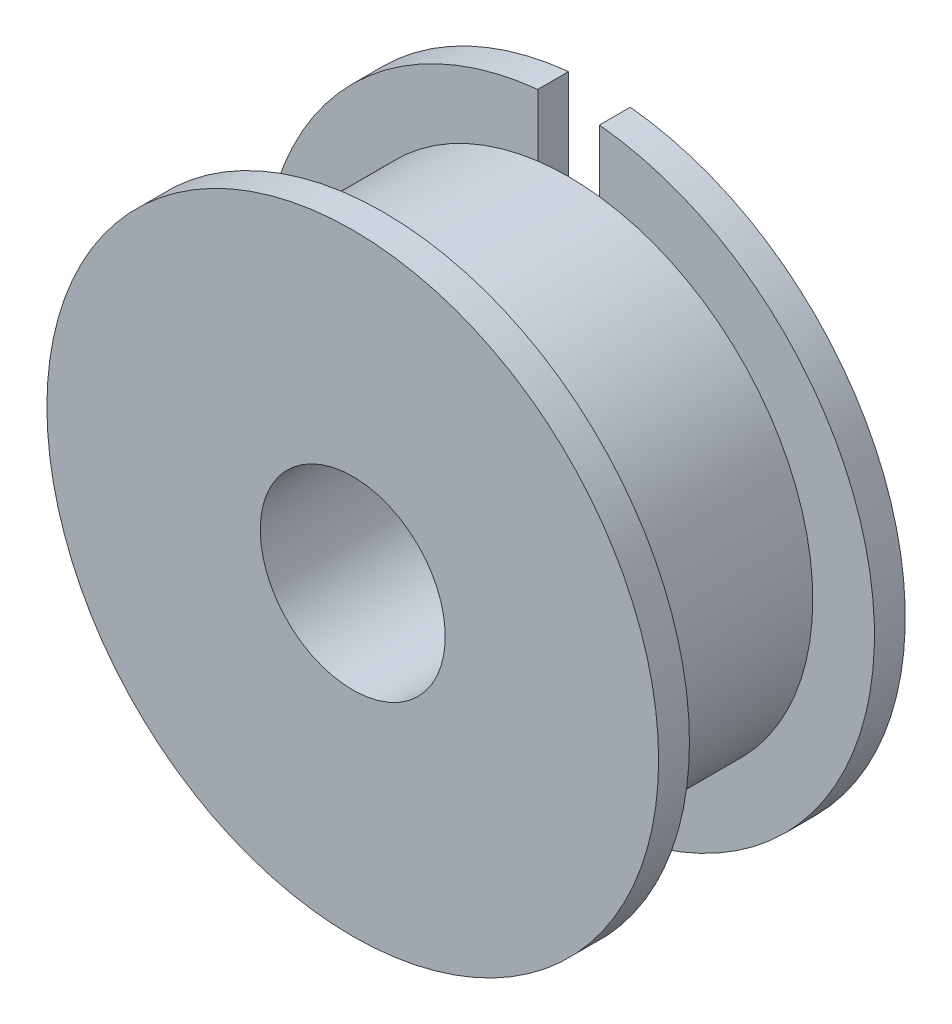
ISO-10303-21;
HEADER;
FILE_DESCRIPTION(('STEP AP214'),'2;1');
FILE_NAME('part.step','',(''),(''),'','','');
FILE_SCHEMA(('AUTOMOTIVE_DESIGN { 1 0 10303 214 1 1 1 1 }'));
ENDSEC;
DATA;
#1=APPLICATION_CONTEXT('core data for automotive mechanical design processes');
#2=APPLICATION_PROTOCOL_DEFINITION('international standard','automotive_design',2000,#1);
#3=PRODUCT_CONTEXT('',#1,'mechanical');
#4=PRODUCT('Part','Part','',(#3));
#5=PRODUCT_RELATED_PRODUCT_CATEGORY('part','',(#4));
#6=PRODUCT_DEFINITION_FORMATION('','',#4);
#7=PRODUCT_DEFINITION_CONTEXT('part definition',#1,'design');
#8=PRODUCT_DEFINITION('design','',#6,#7);
#9=PRODUCT_DEFINITION_SHAPE('','',#8);
#10=(LENGTH_UNIT() NAMED_UNIT(*) SI_UNIT(.MILLI.,.METRE.));
#11=(NAMED_UNIT(*) PLANE_ANGLE_UNIT() SI_UNIT($,.RADIAN.));
#12=(NAMED_UNIT(*) SI_UNIT($,.STERADIAN.) SOLID_ANGLE_UNIT());
#13=UNCERTAINTY_MEASURE_WITH_UNIT(LENGTH_MEASURE(1.E-05),#10,'distance_accuracy_value','');
#14=(GEOMETRIC_REPRESENTATION_CONTEXT(3) GLOBAL_UNCERTAINTY_ASSIGNED_CONTEXT((#13)) GLOBAL_UNIT_ASSIGNED_CONTEXT((#10,
#11,#12)) REPRESENTATION_CONTEXT('',''));
#15=CARTESIAN_POINT('',(0.,0.,0.));
#16=DIRECTION('',(0.,0.,1.));
#17=DIRECTION('',(1.,0.,0.));
#18=AXIS2_PLACEMENT_3D('',#15,#16,#17);
#19=CARTESIAN_POINT('',(-44.3224602815943,0.,-22.225));
#20=DIRECTION('',(0.,0.,1.));
#21=DIRECTION('',(1.,0.,0.));
#22=AXIS2_PLACEMENT_3D('',#19,#20,#21);
#23=PLANE('',#22);
#24=CARTESIAN_POINT('',(-44.3224602815943,-29.05999997,-22.225));
#25=DIRECTION('',(0.,0.,-1.));
#26=DIRECTION('',(-1.,0.,0.));
#27=AXIS2_PLACEMENT_3D('',#24,#25,#26);
#28=CIRCLE('',#27,4.7625);
#29=CARTESIAN_POINT('',(-49.0849602815943,-29.05999997,-22.225));
#30=VERTEX_POINT('',#29);
#31=EDGE_CURVE('E11',#30,#30,#28,.T.);
#32=ORIENTED_EDGE('',*,*,#31,.F.);
#33=EDGE_LOOP('',(#32));
#34=FACE_BOUND('',#33,.T.);
#35=DIRECTION('',(0.,-1.,0.));
#36=VECTOR('',#35,1.);
#37=CARTESIAN_POINT('',(-45.9099602815943,0.,-22.225));
#38=LINE('',#37,#36);
#39=CARTESIAN_POINT('',(-45.9099602815943,-13.3922194076485,-22.225));
#40=VERTEX_POINT('',#39);
#41=CARTESIAN_POINT('',(-45.9099602815943,-19.66199997,-22.225));
#42=VERTEX_POINT('',#41);
#43=EDGE_CURVE('E110',#40,#42,#38,.T.);
#44=ORIENTED_EDGE('',*,*,#43,.T.);
#45=CARTESIAN_POINT('',(-44.3224602815943,-19.66199997,-22.225));
#46=DIRECTION('',(0.,0.,-1.));
#47=DIRECTION('',(-1.,0.,0.));
#48=AXIS2_PLACEMENT_3D('',#45,#46,#47);
#49=CIRCLE('',#48,1.5875);
#50=CARTESIAN_POINT('',(-42.7349602815943,-19.66199997,-22.225));
#51=VERTEX_POINT('',#50);
#52=EDGE_CURVE('E93',#51,#42,#49,.T.);
#53=ORIENTED_EDGE('',*,*,#52,.F.);
#54=DIRECTION('',(0.,-1.,0.));
#55=VECTOR('',#54,1.);
#56=CARTESIAN_POINT('',(-42.7349602815943,0.,-22.225));
#57=LINE('',#56,#55);
#58=CARTESIAN_POINT('',(-42.7349602815943,-13.3922194076485,-22.225));
#59=VERTEX_POINT('',#58);
#60=EDGE_CURVE('E100',#59,#51,#57,.T.);
#61=ORIENTED_EDGE('',*,*,#60,.F.);
#62=CARTESIAN_POINT('',(-44.3224602815943,-29.05999997,-22.225));
#63=DIRECTION('',(0.,0.,-1.));
#64=DIRECTION('',(-1.,0.,0.));
#65=AXIS2_PLACEMENT_3D('',#62,#63,#64);
#66=CIRCLE('',#65,15.748);
#67=EDGE_CURVE('E43',#59,#40,#66,.T.);
#68=ORIENTED_EDGE('',*,*,#67,.T.);
#69=EDGE_LOOP('',(#44,#53,#61,#68));
#70=FACE_BOUND('',#69,.T.);
#71=ADVANCED_FACE('F35',(#34,#70),#23,.F.);
#72=CARTESIAN_POINT('',(-44.3224602815943,-29.05999997,-22.225));
#73=DIRECTION('',(0.,0.,-1.));
#74=DIRECTION('',(-1.,0.,0.));
#75=AXIS2_PLACEMENT_3D('',#72,#73,#74);
#76=CYLINDRICAL_SURFACE('',#75,15.748);
#77=DIRECTION('',(0.,0.,-1.));
#78=VECTOR('',#77,1.);
#79=CARTESIAN_POINT('',(-45.9099602815943,-13.3922194076485,-12.088550868674));
#80=LINE('',#79,#78);
#81=CARTESIAN_POINT('',(-45.9099602815943,-13.3922194076485,-20.6375));
#82=VERTEX_POINT('',#81);
#83=EDGE_CURVE('E95',#82,#40,#80,.T.);
#84=ORIENTED_EDGE('',*,*,#83,.T.);
#85=ORIENTED_EDGE('',*,*,#67,.F.);
#86=DIRECTION('',(0.,0.,-1.));
#87=VECTOR('',#86,1.);
#88=CARTESIAN_POINT('',(-42.7349602815943,-13.3922194076485,-12.088550868674));
#89=LINE('',#88,#87);
#90=CARTESIAN_POINT('',(-42.7349602815943,-13.3922194076485,-20.6375));
#91=VERTEX_POINT('',#90);
#92=EDGE_CURVE('E108',#91,#59,#89,.T.);
#93=ORIENTED_EDGE('',*,*,#92,.F.);
#94=CARTESIAN_POINT('',(-44.3224602815943,-29.05999997,-20.6375));
#95=DIRECTION('',(0.,0.,-1.));
#96=DIRECTION('',(-1.,0.,0.));
#97=AXIS2_PLACEMENT_3D('',#94,#95,#96);
#98=CIRCLE('',#97,15.748);
#99=EDGE_CURVE('E128',#91,#82,#98,.T.);
#100=ORIENTED_EDGE('',*,*,#99,.T.);
#101=EDGE_LOOP('',(#84,#85,#93,#100));
#102=FACE_BOUND('',#101,.T.);
#103=ADVANCED_FACE('F137',(#102),#76,.T.);
#104=CARTESIAN_POINT('',(-44.3224602815943,-1.5785983631389E-13,-20.6375));
#105=DIRECTION('',(0.,0.,1.));
#106=DIRECTION('',(1.,0.,0.));
#107=AXIS2_PLACEMENT_3D('',#104,#105,#106);
#108=PLANE('',#107);
#109=CARTESIAN_POINT('',(-44.3224602815943,-29.05999997,-20.6375));
#110=DIRECTION('',(0.,0.,-1.));
#111=DIRECTION('',(-1.,0.,0.));
#112=AXIS2_PLACEMENT_3D('',#109,#110,#111);
#113=CIRCLE('',#112,12.573);
#114=CARTESIAN_POINT('',(-42.7349602815943,-16.5876235825588,-20.6375));
#115=VERTEX_POINT('',#114);
#116=CARTESIAN_POINT('',(-45.9099602815943,-16.5876235825588,-20.6375));
#117=VERTEX_POINT('',#116);
#118=EDGE_CURVE('E126',#115,#117,#113,.T.);
#119=ORIENTED_EDGE('',*,*,#118,.T.);
#120=DIRECTION('',(0.,-1.,0.));
#121=VECTOR('',#120,1.);
#122=CARTESIAN_POINT('',(-45.9099602815943,0.,-20.6375));
#123=LINE('',#122,#121);
#124=EDGE_CURVE('E50',#82,#117,#123,.T.);
#125=ORIENTED_EDGE('',*,*,#124,.F.);
#126=ORIENTED_EDGE('',*,*,#99,.F.);
#127=DIRECTION('',(0.,-1.,0.));
#128=VECTOR('',#127,1.);
#129=CARTESIAN_POINT('',(-42.7349602815943,0.,-20.6375));
#130=LINE('',#129,#128);
#131=EDGE_CURVE('E104',#91,#115,#130,.T.);
#132=ORIENTED_EDGE('',*,*,#131,.T.);
#133=EDGE_LOOP('',(#119,#125,#126,#132));
#134=FACE_BOUND('',#133,.T.);
#135=ADVANCED_FACE('F140',(#134),#108,.T.);
#136=CARTESIAN_POINT('',(-44.3224602815943,-29.05999997,-22.225));
#137=DIRECTION('',(0.,0.,-1.));
#138=DIRECTION('',(-1.,0.,0.));
#139=AXIS2_PLACEMENT_3D('',#136,#137,#138);
#140=CYLINDRICAL_SURFACE('',#139,4.7625);
#141=CARTESIAN_POINT('',(-44.3224602815943,-29.05999997,-9.52499999999999));
#142=DIRECTION('',(0.,0.,-1.));
#143=DIRECTION('',(-1.,0.,0.));
#144=AXIS2_PLACEMENT_3D('',#141,#142,#143);
#145=CIRCLE('',#144,4.7625);
#146=CARTESIAN_POINT('',(-49.0849602815943,-29.05999997,-9.52499999999999));
#147=VERTEX_POINT('',#146);
#148=EDGE_CURVE('E114',#147,#147,#145,.T.);
#149=ORIENTED_EDGE('',*,*,#148,.F.);
#150=EDGE_LOOP('',(#149));
#151=FACE_BOUND('',#150,.T.);
#152=ORIENTED_EDGE('',*,*,#31,.T.);
#153=EDGE_LOOP('',(#152));
#154=FACE_BOUND('',#153,.T.);
#155=ADVANCED_FACE('F37',(#151,#154),#140,.F.);
#156=CARTESIAN_POINT('',(-44.3224602815943,-29.05999997,-22.225));
#157=DIRECTION('',(0.,0.,-1.));
#158=DIRECTION('',(-1.,0.,0.));
#159=AXIS2_PLACEMENT_3D('',#156,#157,#158);
#160=CYLINDRICAL_SURFACE('',#159,12.573);
#161=EDGE_CURVE('E57',#117,#115,#113,.T.);
#162=ORIENTED_EDGE('',*,*,#161,.F.);
#163=ORIENTED_EDGE('',*,*,#118,.F.);
#164=EDGE_LOOP('',(#162,#163));
#165=FACE_BOUND('',#164,.T.);
#166=CARTESIAN_POINT('',(-44.3224602815943,-29.05999997,-11.1125));
#167=DIRECTION('',(0.,0.,-1.));
#168=DIRECTION('',(-1.,0.,0.));
#169=AXIS2_PLACEMENT_3D('',#166,#167,#168);
#170=CIRCLE('',#169,12.573);
#171=CARTESIAN_POINT('',(-56.8954602815943,-29.05999997,-11.1125));
#172=VERTEX_POINT('',#171);
#173=EDGE_CURVE('E123',#172,#172,#170,.T.);
#174=ORIENTED_EDGE('',*,*,#173,.T.);
#175=EDGE_LOOP('',(#174));
#176=FACE_BOUND('',#175,.T.);
#177=ADVANCED_FACE('F143',(#165,#176),#160,.T.);
#178=CARTESIAN_POINT('',(-44.3224602815943,0.,-11.1125));
#179=DIRECTION('',(0.,0.,1.));
#180=DIRECTION('',(1.,0.,0.));
#181=AXIS2_PLACEMENT_3D('',#178,#179,#180);
#182=PLANE('',#181);
#183=ORIENTED_EDGE('',*,*,#173,.F.);
#184=EDGE_LOOP('',(#183));
#185=FACE_BOUND('',#184,.T.);
#186=CARTESIAN_POINT('',(-44.3224602815943,-29.05999997,-11.1125));
#187=DIRECTION('',(0.,0.,-1.));
#188=DIRECTION('',(-1.,0.,0.));
#189=AXIS2_PLACEMENT_3D('',#186,#187,#188);
#190=CIRCLE('',#189,15.748);
#191=CARTESIAN_POINT('',(-60.0704602815944,-29.05999997,-11.1125));
#192=VERTEX_POINT('',#191);
#193=EDGE_CURVE('E120',#192,#192,#190,.T.);
#194=ORIENTED_EDGE('',*,*,#193,.T.);
#195=EDGE_LOOP('',(#194));
#196=FACE_BOUND('',#195,.T.);
#197=ADVANCED_FACE('F146',(#185,#196),#182,.F.);
#198=CARTESIAN_POINT('',(-44.3224602815943,-29.05999997,-22.225));
#199=DIRECTION('',(0.,0.,-1.));
#200=DIRECTION('',(-1.,0.,0.));
#201=AXIS2_PLACEMENT_3D('',#198,#199,#200);
#202=CYLINDRICAL_SURFACE('',#201,15.748);
#203=CARTESIAN_POINT('',(-44.3224602815943,-29.05999997,-9.52499999999999));
#204=DIRECTION('',(0.,0.,-1.));
#205=DIRECTION('',(-1.,0.,0.));
#206=AXIS2_PLACEMENT_3D('',#203,#204,#205);
#207=CIRCLE('',#206,15.748);
#208=CARTESIAN_POINT('',(-60.0704602815943,-29.05999997,-9.52499999999999));
#209=VERTEX_POINT('',#208);
#210=EDGE_CURVE('E117',#209,#209,#207,.T.);
#211=ORIENTED_EDGE('',*,*,#210,.T.);
#212=EDGE_LOOP('',(#211));
#213=FACE_BOUND('',#212,.T.);
#214=ORIENTED_EDGE('',*,*,#193,.F.);
#215=EDGE_LOOP('',(#214));
#216=FACE_BOUND('',#215,.T.);
#217=ADVANCED_FACE('F152',(#213,#216),#202,.T.);
#218=CARTESIAN_POINT('',(-44.3224602815943,0.,-9.52499999999999));
#219=DIRECTION('',(0.,0.,1.));
#220=DIRECTION('',(1.,0.,0.));
#221=AXIS2_PLACEMENT_3D('',#218,#219,#220);
#222=PLANE('',#221);
#223=ORIENTED_EDGE('',*,*,#148,.T.);
#224=EDGE_LOOP('',(#223));
#225=FACE_BOUND('',#224,.T.);
#226=ORIENTED_EDGE('',*,*,#210,.F.);
#227=EDGE_LOOP('',(#226));
#228=FACE_BOUND('',#227,.T.);
#229=ADVANCED_FACE('F157',(#225,#228),#222,.T.);
#230=CARTESIAN_POINT('',(-44.3224602815943,-1.5785983631389E-13,-20.6375));
#231=DIRECTION('',(0.,0.,1.));
#232=DIRECTION('',(1.,0.,0.));
#233=AXIS2_PLACEMENT_3D('',#230,#231,#232);
#234=PLANE('',#233);
#235=CARTESIAN_POINT('',(-42.7349602815943,-19.66199997,-20.6375));
#236=VERTEX_POINT('',#235);
#237=EDGE_CURVE('E98',#115,#236,#130,.T.);
#238=ORIENTED_EDGE('',*,*,#237,.T.);
#239=CARTESIAN_POINT('',(-44.3224602815943,-19.66199997,-20.6375));
#240=DIRECTION('',(0.,0.,1.));
#241=DIRECTION('',(1.,0.,0.));
#242=AXIS2_PLACEMENT_3D('',#239,#240,#241);
#243=CIRCLE('',#242,1.5875);
#244=CARTESIAN_POINT('',(-45.9099602815943,-19.66199997,-20.6375));
#245=VERTEX_POINT('',#244);
#246=EDGE_CURVE('E90',#236,#245,#243,.F.);
#247=ORIENTED_EDGE('',*,*,#246,.T.);
#248=EDGE_CURVE('E79',#117,#245,#123,.T.);
#249=ORIENTED_EDGE('',*,*,#248,.F.);
#250=ORIENTED_EDGE('',*,*,#161,.T.);
#251=EDGE_LOOP('',(#238,#247,#249,#250));
#252=FACE_BOUND('',#251,.T.);
#253=ADVANCED_FACE('F97',(#252),#234,.F.);
#254=CARTESIAN_POINT('',(-44.3224602815943,-19.66199997,-12.088550868674));
#255=DIRECTION('',(0.,0.,-1.));
#256=DIRECTION('',(-1.,0.,0.));
#257=AXIS2_PLACEMENT_3D('',#254,#255,#256);
#258=CYLINDRICAL_SURFACE('',#257,1.5875);
#259=DIRECTION('',(0.,0.,-1.));
#260=VECTOR('',#259,1.);
#261=CARTESIAN_POINT('',(-42.7349602815943,-19.66199997,-12.088550868674));
#262=LINE('',#261,#260);
#263=EDGE_CURVE('E106',#236,#51,#262,.T.);
#264=ORIENTED_EDGE('',*,*,#263,.T.);
#265=ORIENTED_EDGE('',*,*,#52,.T.);
#266=DIRECTION('',(0.,0.,-1.));
#267=VECTOR('',#266,1.);
#268=CARTESIAN_POINT('',(-45.9099602815943,-19.66199997,-12.088550868674));
#269=LINE('',#268,#267);
#270=EDGE_CURVE('E82',#245,#42,#269,.T.);
#271=ORIENTED_EDGE('',*,*,#270,.F.);
#272=ORIENTED_EDGE('',*,*,#246,.F.);
#273=EDGE_LOOP('',(#264,#265,#271,#272));
#274=FACE_BOUND('',#273,.T.);
#275=ADVANCED_FACE('F89',(#274),#258,.F.);
#276=CARTESIAN_POINT('',(-45.9099602815943,0.,-12.088550868674));
#277=DIRECTION('',(1.,0.,0.));
#278=DIRECTION('',(0.,0.,-1.));
#279=AXIS2_PLACEMENT_3D('',#276,#277,#278);
#280=PLANE('',#279);
#281=ORIENTED_EDGE('',*,*,#124,.T.);
#282=ORIENTED_EDGE('',*,*,#248,.T.);
#283=ORIENTED_EDGE('',*,*,#270,.T.);
#284=ORIENTED_EDGE('',*,*,#43,.F.);
#285=ORIENTED_EDGE('',*,*,#83,.F.);
#286=EDGE_LOOP('',(#281,#282,#283,#284,#285));
#287=FACE_BOUND('',#286,.T.);
#288=ADVANCED_FACE('F81',(#287),#280,.T.);
#289=CARTESIAN_POINT('',(-42.7349602815943,0.,-12.088550868674));
#290=DIRECTION('',(1.,0.,0.));
#291=DIRECTION('',(0.,0.,-1.));
#292=AXIS2_PLACEMENT_3D('',#289,#290,#291);
#293=PLANE('',#292);
#294=ORIENTED_EDGE('',*,*,#92,.T.);
#295=ORIENTED_EDGE('',*,*,#60,.T.);
#296=ORIENTED_EDGE('',*,*,#263,.F.);
#297=ORIENTED_EDGE('',*,*,#237,.F.);
#298=ORIENTED_EDGE('',*,*,#131,.F.);
#299=EDGE_LOOP('',(#294,#295,#296,#297,#298));
#300=FACE_BOUND('',#299,.T.);
#301=ADVANCED_FACE('F240',(#300),#293,.F.);
#302=CLOSED_SHELL('',(#71,#103,#135,#155,#177,#197,#217,#229,#253,#275,#288,#301));
#303=MANIFOLD_SOLID_BREP('B2',#302);
#304=ADVANCED_BREP_SHAPE_REPRESENTATION('',(#18,#303),#14);
#305=SHAPE_DEFINITION_REPRESENTATION(#9,#304);
ENDSEC;
END-ISO-10303-21;
